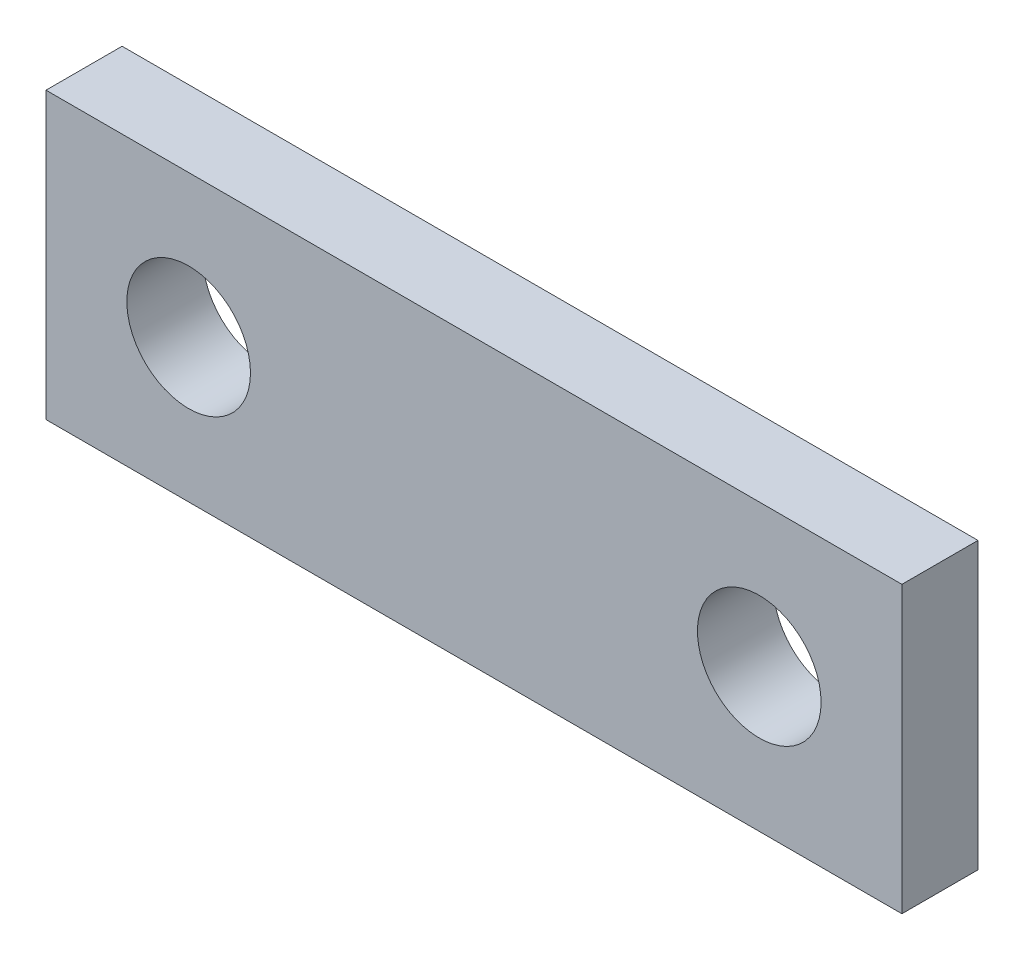
ISO-10303-21;
HEADER;
FILE_DESCRIPTION(('STEP AP214'),'2;1');
FILE_NAME('part.step','',(''),(''),'','','');
FILE_SCHEMA(('AUTOMOTIVE_DESIGN { 1 0 10303 214 1 1 1 1 }'));
ENDSEC;
DATA;
#1=APPLICATION_CONTEXT('core data for automotive mechanical design processes');
#2=APPLICATION_PROTOCOL_DEFINITION('international standard','automotive_design',2000,#1);
#3=PRODUCT_CONTEXT('',#1,'mechanical');
#4=PRODUCT('Part','Part','',(#3));
#5=PRODUCT_RELATED_PRODUCT_CATEGORY('part','',(#4));
#6=PRODUCT_DEFINITION_FORMATION('','',#4);
#7=PRODUCT_DEFINITION_CONTEXT('part definition',#1,'design');
#8=PRODUCT_DEFINITION('design','',#6,#7);
#9=PRODUCT_DEFINITION_SHAPE('','',#8);
#10=(LENGTH_UNIT() NAMED_UNIT(*) SI_UNIT(.MILLI.,.METRE.));
#11=(NAMED_UNIT(*) PLANE_ANGLE_UNIT() SI_UNIT($,.RADIAN.));
#12=(NAMED_UNIT(*) SI_UNIT($,.STERADIAN.) SOLID_ANGLE_UNIT());
#13=UNCERTAINTY_MEASURE_WITH_UNIT(LENGTH_MEASURE(1.E-05),#10,'distance_accuracy_value','');
#14=(GEOMETRIC_REPRESENTATION_CONTEXT(3) GLOBAL_UNCERTAINTY_ASSIGNED_CONTEXT((#13)) GLOBAL_UNIT_ASSIGNED_CONTEXT((#10,
#11,#12)) REPRESENTATION_CONTEXT('',''));
#15=CARTESIAN_POINT('',(0.,0.,0.));
#16=DIRECTION('',(0.,0.,1.));
#17=DIRECTION('',(1.,0.,0.));
#18=AXIS2_PLACEMENT_3D('',#15,#16,#17);
#19=CARTESIAN_POINT('',(0.,0.,8.));
#20=DIRECTION('',(0.,0.,-1.));
#21=DIRECTION('',(-1.,0.,0.));
#22=AXIS2_PLACEMENT_3D('',#19,#20,#21);
#23=PLANE('',#22);
#24=CARTESIAN_POINT('',(15.,15.,8.));
#25=DIRECTION('',(0.,0.,1.));
#26=DIRECTION('',(1.,0.,0.));
#27=AXIS2_PLACEMENT_3D('',#24,#25,#26);
#28=CIRCLE('',#27,6.5);
#29=CARTESIAN_POINT('',(21.5,15.,8.));
#30=VERTEX_POINT('',#29);
#31=EDGE_CURVE('E99',#30,#30,#28,.T.);
#32=ORIENTED_EDGE('',*,*,#31,.F.);
#33=EDGE_LOOP('',(#32));
#34=FACE_BOUND('',#33,.T.);
#35=DIRECTION('',(0.,-1.,0.));
#36=VECTOR('',#35,1.);
#37=CARTESIAN_POINT('',(0.,0.,8.));
#38=LINE('',#37,#36);
#39=CARTESIAN_POINT('',(0.,30.,8.));
#40=VERTEX_POINT('',#39);
#41=CARTESIAN_POINT('',(0.,0.,8.));
#42=VERTEX_POINT('',#41);
#43=EDGE_CURVE('E84',#40,#42,#38,.T.);
#44=ORIENTED_EDGE('',*,*,#43,.T.);
#45=DIRECTION('',(1.,0.,0.));
#46=VECTOR('',#45,1.);
#47=CARTESIAN_POINT('',(0.,0.,8.));
#48=LINE('',#47,#46);
#49=CARTESIAN_POINT('',(90.,0.,8.));
#50=VERTEX_POINT('',#49);
#51=EDGE_CURVE('E79',#42,#50,#48,.T.);
#52=ORIENTED_EDGE('',*,*,#51,.T.);
#53=DIRECTION('',(0.,1.,0.));
#54=VECTOR('',#53,1.);
#55=CARTESIAN_POINT('',(90.,0.,8.));
#56=LINE('',#55,#54);
#57=CARTESIAN_POINT('',(90.,30.,8.));
#58=VERTEX_POINT('',#57);
#59=EDGE_CURVE('E82',#50,#58,#56,.T.);
#60=ORIENTED_EDGE('',*,*,#59,.T.);
#61=DIRECTION('',(-1.,0.,0.));
#62=VECTOR('',#61,1.);
#63=CARTESIAN_POINT('',(0.,30.,8.));
#64=LINE('',#63,#62);
#65=EDGE_CURVE('E49',#58,#40,#64,.T.);
#66=ORIENTED_EDGE('',*,*,#65,.T.);
#67=EDGE_LOOP('',(#44,#52,#60,#66));
#68=FACE_BOUND('',#67,.T.);
#69=CARTESIAN_POINT('',(75.,15.,8.));
#70=DIRECTION('',(0.,0.,1.));
#71=DIRECTION('',(1.,0.,0.));
#72=AXIS2_PLACEMENT_3D('',#69,#70,#71);
#73=CIRCLE('',#72,6.5);
#74=CARTESIAN_POINT('',(81.5,15.,8.));
#75=VERTEX_POINT('',#74);
#76=EDGE_CURVE('E114',#75,#75,#73,.T.);
#77=ORIENTED_EDGE('',*,*,#76,.F.);
#78=EDGE_LOOP('',(#77));
#79=FACE_BOUND('',#78,.T.);
#80=ADVANCED_FACE('F32',(#34,#68,#79),#23,.F.);
#81=CARTESIAN_POINT('',(0.,0.,0.));
#82=DIRECTION('',(0.,0.,-1.));
#83=DIRECTION('',(-1.,0.,0.));
#84=AXIS2_PLACEMENT_3D('',#81,#82,#83);
#85=PLANE('',#84);
#86=CARTESIAN_POINT('',(15.,15.,0.));
#87=DIRECTION('',(0.,0.,1.));
#88=DIRECTION('',(1.,0.,0.));
#89=AXIS2_PLACEMENT_3D('',#86,#87,#88);
#90=CIRCLE('',#89,6.5);
#91=CARTESIAN_POINT('',(21.5,15.,0.));
#92=VERTEX_POINT('',#91);
#93=EDGE_CURVE('E111',#92,#92,#90,.T.);
#94=ORIENTED_EDGE('',*,*,#93,.T.);
#95=EDGE_LOOP('',(#94));
#96=FACE_BOUND('',#95,.T.);
#97=DIRECTION('',(0.,-1.,0.));
#98=VECTOR('',#97,1.);
#99=CARTESIAN_POINT('',(0.,0.,0.));
#100=LINE('',#99,#98);
#101=CARTESIAN_POINT('',(0.,30.,0.));
#102=VERTEX_POINT('',#101);
#103=CARTESIAN_POINT('',(0.,0.,0.));
#104=VERTEX_POINT('',#103);
#105=EDGE_CURVE('E96',#102,#104,#100,.T.);
#106=ORIENTED_EDGE('',*,*,#105,.F.);
#107=DIRECTION('',(-1.,0.,0.));
#108=VECTOR('',#107,1.);
#109=CARTESIAN_POINT('',(0.,30.,0.));
#110=LINE('',#109,#108);
#111=CARTESIAN_POINT('',(90.,30.,0.));
#112=VERTEX_POINT('',#111);
#113=EDGE_CURVE('E72',#112,#102,#110,.T.);
#114=ORIENTED_EDGE('',*,*,#113,.F.);
#115=DIRECTION('',(0.,1.,0.));
#116=VECTOR('',#115,1.);
#117=CARTESIAN_POINT('',(90.,0.,0.));
#118=LINE('',#117,#116);
#119=CARTESIAN_POINT('',(90.,0.,0.));
#120=VERTEX_POINT('',#119);
#121=EDGE_CURVE('E66',#120,#112,#118,.T.);
#122=ORIENTED_EDGE('',*,*,#121,.F.);
#123=DIRECTION('',(1.,0.,0.));
#124=VECTOR('',#123,1.);
#125=CARTESIAN_POINT('',(0.,0.,0.));
#126=LINE('',#125,#124);
#127=EDGE_CURVE('E88',#104,#120,#126,.T.);
#128=ORIENTED_EDGE('',*,*,#127,.F.);
#129=EDGE_LOOP('',(#106,#114,#122,#128));
#130=FACE_BOUND('',#129,.T.);
#131=CARTESIAN_POINT('',(75.,15.,0.));
#132=DIRECTION('',(0.,0.,1.));
#133=DIRECTION('',(1.,0.,0.));
#134=AXIS2_PLACEMENT_3D('',#131,#132,#133);
#135=CIRCLE('',#134,6.5);
#136=CARTESIAN_POINT('',(81.5,15.,0.));
#137=VERTEX_POINT('',#136);
#138=EDGE_CURVE('E117',#137,#137,#135,.T.);
#139=ORIENTED_EDGE('',*,*,#138,.T.);
#140=EDGE_LOOP('',(#139));
#141=FACE_BOUND('',#140,.T.);
#142=ADVANCED_FACE('F107',(#96,#130,#141),#85,.T.);
#143=CARTESIAN_POINT('',(0.,0.,8.));
#144=DIRECTION('',(1.,0.,0.));
#145=DIRECTION('',(0.,0.,-1.));
#146=AXIS2_PLACEMENT_3D('',#143,#144,#145);
#147=PLANE('',#146);
#148=ORIENTED_EDGE('',*,*,#105,.T.);
#149=DIRECTION('',(0.,0.,-1.));
#150=VECTOR('',#149,1.);
#151=CARTESIAN_POINT('',(0.,0.,8.));
#152=LINE('',#151,#150);
#153=EDGE_CURVE('E11',#42,#104,#152,.T.);
#154=ORIENTED_EDGE('',*,*,#153,.F.);
#155=ORIENTED_EDGE('',*,*,#43,.F.);
#156=DIRECTION('',(0.,0.,-1.));
#157=VECTOR('',#156,1.);
#158=CARTESIAN_POINT('',(0.,30.,8.));
#159=LINE('',#158,#157);
#160=EDGE_CURVE('E92',#40,#102,#159,.T.);
#161=ORIENTED_EDGE('',*,*,#160,.T.);
#162=EDGE_LOOP('',(#148,#154,#155,#161));
#163=FACE_BOUND('',#162,.T.);
#164=ADVANCED_FACE('F34',(#163),#147,.F.);
#165=CARTESIAN_POINT('',(0.,0.,8.));
#166=DIRECTION('',(0.,1.,0.));
#167=DIRECTION('',(0.,0.,1.));
#168=AXIS2_PLACEMENT_3D('',#165,#166,#167);
#169=PLANE('',#168);
#170=ORIENTED_EDGE('',*,*,#127,.T.);
#171=DIRECTION('',(0.,0.,-1.));
#172=VECTOR('',#171,1.);
#173=CARTESIAN_POINT('',(90.,0.,8.));
#174=LINE('',#173,#172);
#175=EDGE_CURVE('E41',#50,#120,#174,.T.);
#176=ORIENTED_EDGE('',*,*,#175,.F.);
#177=ORIENTED_EDGE('',*,*,#51,.F.);
#178=ORIENTED_EDGE('',*,*,#153,.T.);
#179=EDGE_LOOP('',(#170,#176,#177,#178));
#180=FACE_BOUND('',#179,.T.);
#181=ADVANCED_FACE('F87',(#180),#169,.F.);
#182=CARTESIAN_POINT('',(90.,0.,8.));
#183=DIRECTION('',(-1.,0.,0.));
#184=DIRECTION('',(0.,0.,1.));
#185=AXIS2_PLACEMENT_3D('',#182,#183,#184);
#186=PLANE('',#185);
#187=ORIENTED_EDGE('',*,*,#121,.T.);
#188=DIRECTION('',(0.,0.,-1.));
#189=VECTOR('',#188,1.);
#190=CARTESIAN_POINT('',(90.,30.,8.));
#191=LINE('',#190,#189);
#192=EDGE_CURVE('E89',#58,#112,#191,.T.);
#193=ORIENTED_EDGE('',*,*,#192,.F.);
#194=ORIENTED_EDGE('',*,*,#59,.F.);
#195=ORIENTED_EDGE('',*,*,#175,.T.);
#196=EDGE_LOOP('',(#187,#193,#194,#195));
#197=FACE_BOUND('',#196,.T.);
#198=ADVANCED_FACE('F90',(#197),#186,.F.);
#199=CARTESIAN_POINT('',(0.,30.,8.));
#200=DIRECTION('',(0.,-1.,0.));
#201=DIRECTION('',(0.,0.,-1.));
#202=AXIS2_PLACEMENT_3D('',#199,#200,#201);
#203=PLANE('',#202);
#204=ORIENTED_EDGE('',*,*,#113,.T.);
#205=ORIENTED_EDGE('',*,*,#160,.F.);
#206=ORIENTED_EDGE('',*,*,#65,.F.);
#207=ORIENTED_EDGE('',*,*,#192,.T.);
#208=EDGE_LOOP('',(#204,#205,#206,#207));
#209=FACE_BOUND('',#208,.T.);
#210=ADVANCED_FACE('F104',(#209),#203,.F.);
#211=CARTESIAN_POINT('',(15.,15.,8.));
#212=DIRECTION('',(0.,0.,-1.));
#213=DIRECTION('',(-1.,0.,0.));
#214=AXIS2_PLACEMENT_3D('',#211,#212,#213);
#215=CYLINDRICAL_SURFACE('',#214,6.5);
#216=ORIENTED_EDGE('',*,*,#31,.T.);
#217=EDGE_LOOP('',(#216));
#218=FACE_BOUND('',#217,.T.);
#219=ORIENTED_EDGE('',*,*,#93,.F.);
#220=EDGE_LOOP('',(#219));
#221=FACE_BOUND('',#220,.T.);
#222=ADVANCED_FACE('F135',(#218,#221),#215,.F.);
#223=CARTESIAN_POINT('',(75.,15.,8.));
#224=DIRECTION('',(0.,0.,-1.));
#225=DIRECTION('',(-1.,0.,0.));
#226=AXIS2_PLACEMENT_3D('',#223,#224,#225);
#227=CYLINDRICAL_SURFACE('',#226,6.5);
#228=ORIENTED_EDGE('',*,*,#76,.T.);
#229=EDGE_LOOP('',(#228));
#230=FACE_BOUND('',#229,.T.);
#231=ORIENTED_EDGE('',*,*,#138,.F.);
#232=EDGE_LOOP('',(#231));
#233=FACE_BOUND('',#232,.T.);
#234=ADVANCED_FACE('F123',(#230,#233),#227,.F.);
#235=CLOSED_SHELL('',(#80,#142,#164,#181,#198,#210,#222,#234));
#236=MANIFOLD_SOLID_BREP('B2',#235);
#237=ADVANCED_BREP_SHAPE_REPRESENTATION('',(#18,#236),#14);
#238=SHAPE_DEFINITION_REPRESENTATION(#9,#237);
ENDSEC;
END-ISO-10303-21;
